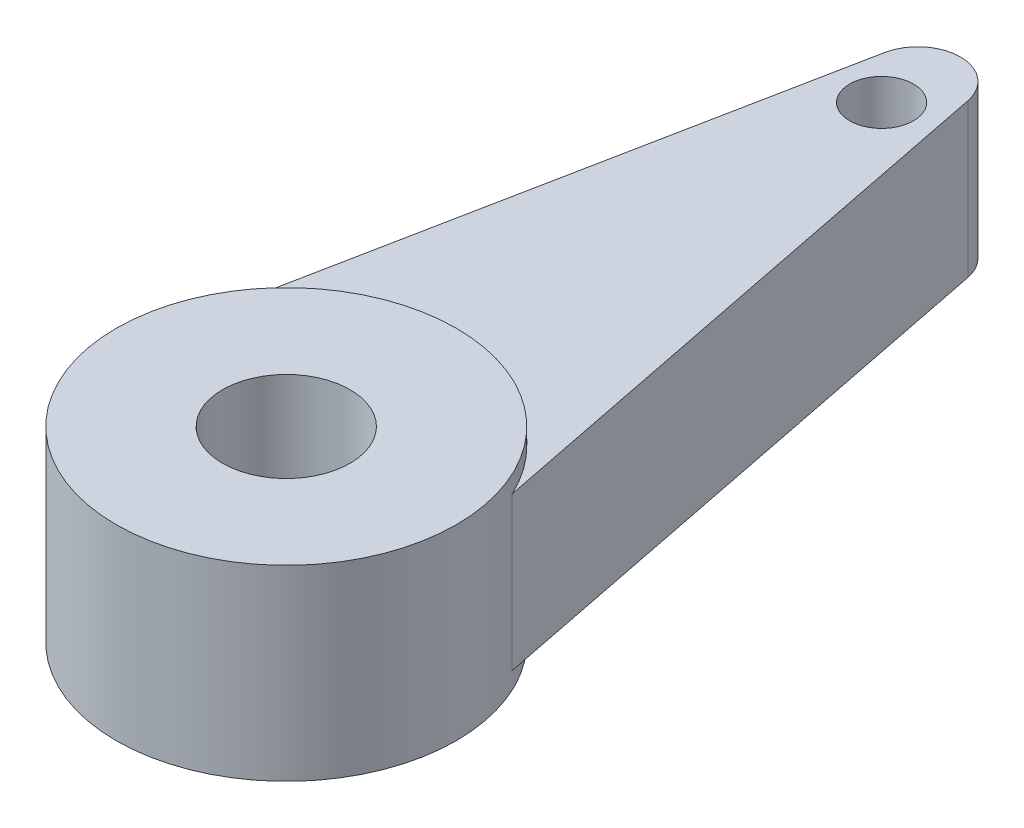
ISO-10303-21;
HEADER;
FILE_DESCRIPTION(('STEP AP214'),'2;1');
FILE_NAME('part.step','',(''),(''),'','','');
FILE_SCHEMA(('AUTOMOTIVE_DESIGN { 1 0 10303 214 1 1 1 1 }'));
ENDSEC;
DATA;
#1=APPLICATION_CONTEXT('core data for automotive mechanical design processes');
#2=APPLICATION_PROTOCOL_DEFINITION('international standard','automotive_design',2000,#1);
#3=PRODUCT_CONTEXT('',#1,'mechanical');
#4=PRODUCT('Part','Part','',(#3));
#5=PRODUCT_RELATED_PRODUCT_CATEGORY('part','',(#4));
#6=PRODUCT_DEFINITION_FORMATION('','',#4);
#7=PRODUCT_DEFINITION_CONTEXT('part definition',#1,'design');
#8=PRODUCT_DEFINITION('design','',#6,#7);
#9=PRODUCT_DEFINITION_SHAPE('','',#8);
#10=(LENGTH_UNIT() NAMED_UNIT(*) SI_UNIT(.MILLI.,.METRE.));
#11=(NAMED_UNIT(*) PLANE_ANGLE_UNIT() SI_UNIT($,.RADIAN.));
#12=(NAMED_UNIT(*) SI_UNIT($,.STERADIAN.) SOLID_ANGLE_UNIT());
#13=UNCERTAINTY_MEASURE_WITH_UNIT(LENGTH_MEASURE(1.E-05),#10,'distance_accuracy_value','');
#14=(GEOMETRIC_REPRESENTATION_CONTEXT(3) GLOBAL_UNCERTAINTY_ASSIGNED_CONTEXT((#13)) GLOBAL_UNIT_ASSIGNED_CONTEXT((#10,
#11,#12)) REPRESENTATION_CONTEXT('',''));
#15=CARTESIAN_POINT('',(0.,0.,0.));
#16=DIRECTION('',(0.,0.,1.));
#17=DIRECTION('',(1.,0.,0.));
#18=AXIS2_PLACEMENT_3D('',#15,#16,#17);
#19=CARTESIAN_POINT('',(0.,27.94,0.));
#20=DIRECTION('',(0.,-1.,0.));
#21=DIRECTION('',(0.,0.,-1.));
#22=AXIS2_PLACEMENT_3D('',#19,#20,#21);
#23=CYLINDRICAL_SURFACE('',#22,50.8);
#24=CARTESIAN_POINT('',(0.,-27.94,0.));
#25=DIRECTION('',(0.,1.,0.));
#26=DIRECTION('',(0.,0.,1.));
#27=AXIS2_PLACEMENT_3D('',#24,#25,#26);
#28=CIRCLE('',#27,50.8);
#29=CARTESIAN_POINT('',(0.,-27.94,50.8));
#30=VERTEX_POINT('',#29);
#31=EDGE_CURVE('E117',#30,#30,#28,.T.);
#32=ORIENTED_EDGE('',*,*,#31,.T.);
#33=EDGE_LOOP('',(#32));
#34=FACE_BOUND('',#33,.T.);
#35=CARTESIAN_POINT('',(0.,27.94,0.));
#36=DIRECTION('',(0.,1.,0.));
#37=DIRECTION('',(0.,0.,1.));
#38=AXIS2_PLACEMENT_3D('',#35,#36,#37);
#39=CIRCLE('',#38,50.8);
#40=CARTESIAN_POINT('',(0.,27.94,50.8));
#41=VERTEX_POINT('',#40);
#42=EDGE_CURVE('E90',#41,#41,#39,.T.);
#43=ORIENTED_EDGE('',*,*,#42,.F.);
#44=EDGE_LOOP('',(#43));
#45=FACE_BOUND('',#44,.T.);
#46=DIRECTION('',(0.,-1.,0.));
#47=VECTOR('',#46,1.);
#48=CARTESIAN_POINT('',(-46.0705210305103,22.86,-21.4043708615158));
#49=LINE('',#48,#47);
#50=CARTESIAN_POINT('',(-46.0705210305103,22.86,-21.4043708615158));
#51=VERTEX_POINT('',#50);
#52=CARTESIAN_POINT('',(-46.0705210305103,-22.86,-21.4043708615158));
#53=VERTEX_POINT('',#52);
#54=EDGE_CURVE('E87',#51,#53,#49,.T.);
#55=ORIENTED_EDGE('',*,*,#54,.T.);
#56=CARTESIAN_POINT('',(0.,-22.86,0.));
#57=DIRECTION('',(0.,1.,0.));
#58=DIRECTION('',(0.,0.,1.));
#59=AXIS2_PLACEMENT_3D('',#56,#57,#58);
#60=CIRCLE('',#59,50.8);
#61=CARTESIAN_POINT('',(46.0705210305103,-22.86,-21.4043708615158));
#62=VERTEX_POINT('',#61);
#63=EDGE_CURVE('E81',#62,#53,#60,.T.);
#64=ORIENTED_EDGE('',*,*,#63,.F.);
#65=DIRECTION('',(0.,-1.,0.));
#66=VECTOR('',#65,1.);
#67=CARTESIAN_POINT('',(46.0705210305103,22.86,-21.4043708615158));
#68=LINE('',#67,#66);
#69=CARTESIAN_POINT('',(46.0705210305103,22.86,-21.4043708615159));
#70=VERTEX_POINT('',#69);
#71=EDGE_CURVE('E84',#70,#62,#68,.T.);
#72=ORIENTED_EDGE('',*,*,#71,.F.);
#73=CARTESIAN_POINT('',(0.,22.86,0.));
#74=DIRECTION('',(0.,1.,0.));
#75=DIRECTION('',(0.,0.,1.));
#76=AXIS2_PLACEMENT_3D('',#73,#74,#75);
#77=CIRCLE('',#76,50.8);
#78=EDGE_CURVE('E89',#70,#51,#77,.T.);
#79=ORIENTED_EDGE('',*,*,#78,.T.);
#80=EDGE_LOOP('',(#55,#64,#72,#79));
#81=FACE_BOUND('',#80,.T.);
#82=ADVANCED_FACE('F39',(#34,#45,#81),#23,.T.);
#83=CARTESIAN_POINT('',(0.,27.94,0.));
#84=DIRECTION('',(0.,1.,0.));
#85=DIRECTION('',(0.,0.,1.));
#86=AXIS2_PLACEMENT_3D('',#83,#84,#85);
#87=PLANE('',#86);
#88=ORIENTED_EDGE('',*,*,#42,.T.);
#89=EDGE_LOOP('',(#88));
#90=FACE_BOUND('',#89,.T.);
#91=CARTESIAN_POINT('',(0.,27.94,0.));
#92=DIRECTION('',(0.,1.,0.));
#93=DIRECTION('',(0.,0.,1.));
#94=AXIS2_PLACEMENT_3D('',#91,#92,#93);
#95=CIRCLE('',#94,19.05);
#96=CARTESIAN_POINT('',(0.,27.94,19.05));
#97=VERTEX_POINT('',#96);
#98=EDGE_CURVE('E113',#97,#97,#95,.T.);
#99=ORIENTED_EDGE('',*,*,#98,.F.);
#100=EDGE_LOOP('',(#99));
#101=FACE_BOUND('',#100,.T.);
#102=ADVANCED_FACE('F165',(#90,#101),#87,.T.);
#103=CARTESIAN_POINT('',(0.,-27.94,0.));
#104=DIRECTION('',(0.,1.,0.));
#105=DIRECTION('',(0.,0.,1.));
#106=AXIS2_PLACEMENT_3D('',#103,#104,#105);
#107=PLANE('',#106);
#108=ORIENTED_EDGE('',*,*,#31,.F.);
#109=EDGE_LOOP('',(#108));
#110=FACE_BOUND('',#109,.T.);
#111=CARTESIAN_POINT('',(0.,-27.94,0.));
#112=DIRECTION('',(0.,1.,0.));
#113=DIRECTION('',(0.,0.,1.));
#114=AXIS2_PLACEMENT_3D('',#111,#112,#113);
#115=CIRCLE('',#114,19.05);
#116=CARTESIAN_POINT('',(0.,-27.94,19.05));
#117=VERTEX_POINT('',#116);
#118=EDGE_CURVE('E112',#117,#117,#115,.T.);
#119=ORIENTED_EDGE('',*,*,#118,.T.);
#120=EDGE_LOOP('',(#119));
#121=FACE_BOUND('',#120,.T.);
#122=ADVANCED_FACE('F160',(#110,#121),#107,.F.);
#123=CARTESIAN_POINT('',(0.,27.94,0.));
#124=DIRECTION('',(0.,-1.,0.));
#125=DIRECTION('',(0.,0.,-1.));
#126=AXIS2_PLACEMENT_3D('',#123,#124,#125);
#127=CYLINDRICAL_SURFACE('',#126,19.05);
#128=ORIENTED_EDGE('',*,*,#98,.T.);
#129=EDGE_LOOP('',(#128));
#130=FACE_BOUND('',#129,.T.);
#131=ORIENTED_EDGE('',*,*,#118,.F.);
#132=EDGE_LOOP('',(#131));
#133=FACE_BOUND('',#132,.T.);
#134=ADVANCED_FACE('F152',(#130,#133),#127,.F.);
#135=CARTESIAN_POINT('',(0.,22.86,0.));
#136=DIRECTION('',(0.,1.,0.));
#137=DIRECTION('',(0.,0.,1.));
#138=AXIS2_PLACEMENT_3D('',#135,#136,#137);
#139=PLANE('',#138);
#140=DIRECTION('',(-0.194296630022658,0.,-0.980942821759678));
#141=VECTOR('',#140,1.);
#142=CARTESIAN_POINT('',(46.0705210305103,22.86,-21.4043708615158));
#143=LINE('',#142,#141);
#144=CARTESIAN_POINT('',(12.4579738363479,22.86,-191.103592548104));
#145=VERTEX_POINT('',#144);
#146=EDGE_CURVE('E94',#70,#145,#143,.T.);
#147=ORIENTED_EDGE('',*,*,#146,.T.);
#148=CARTESIAN_POINT('',(0.,22.86,-188.636025346816));
#149=DIRECTION('',(0.,1.,0.));
#150=DIRECTION('',(0.,0.,1.));
#151=AXIS2_PLACEMENT_3D('',#148,#149,#150);
#152=CIRCLE('',#151,12.7);
#153=CARTESIAN_POINT('',(-12.4579738363479,22.86,-191.103592548104));
#154=VERTEX_POINT('',#153);
#155=EDGE_CURVE('E11',#145,#154,#152,.T.);
#156=ORIENTED_EDGE('',*,*,#155,.T.);
#157=DIRECTION('',(-0.194296630022658,0.,0.980942821759678));
#158=VECTOR('',#157,1.);
#159=CARTESIAN_POINT('',(0.,22.86,-254.));
#160=LINE('',#159,#158);
#161=EDGE_CURVE('E100',#154,#51,#160,.T.);
#162=ORIENTED_EDGE('',*,*,#161,.T.);
#163=ORIENTED_EDGE('',*,*,#78,.F.);
#164=EDGE_LOOP('',(#147,#156,#162,#163));
#165=FACE_BOUND('',#164,.T.);
#166=CARTESIAN_POINT('',(0.,22.86,-177.8));
#167=DIRECTION('',(0.,1.,0.));
#168=DIRECTION('',(0.,0.,1.));
#169=AXIS2_PLACEMENT_3D('',#166,#167,#168);
#170=CIRCLE('',#169,9.525);
#171=CARTESIAN_POINT('',(0.,22.86,-168.275));
#172=VERTEX_POINT('',#171);
#173=EDGE_CURVE('E106',#172,#172,#170,.T.);
#174=ORIENTED_EDGE('',*,*,#173,.F.);
#175=EDGE_LOOP('',(#174));
#176=FACE_BOUND('',#175,.T.);
#177=ADVANCED_FACE('F150',(#165,#176),#139,.T.);
#178=CARTESIAN_POINT('',(0.,-22.86,0.));
#179=DIRECTION('',(0.,1.,0.));
#180=DIRECTION('',(0.,0.,1.));
#181=AXIS2_PLACEMENT_3D('',#178,#179,#180);
#182=PLANE('',#181);
#183=DIRECTION('',(-0.194296630022658,0.,0.980942821759678));
#184=VECTOR('',#183,1.);
#185=CARTESIAN_POINT('',(0.,-22.86,-254.));
#186=LINE('',#185,#184);
#187=CARTESIAN_POINT('',(-12.4579738363479,-22.86,-191.103592548104));
#188=VERTEX_POINT('',#187);
#189=EDGE_CURVE('E101',#188,#53,#186,.T.);
#190=ORIENTED_EDGE('',*,*,#189,.F.);
#191=CARTESIAN_POINT('',(0.,-22.86,-188.636025346816));
#192=DIRECTION('',(0.,1.,0.));
#193=DIRECTION('',(0.,0.,1.));
#194=AXIS2_PLACEMENT_3D('',#191,#192,#193);
#195=CIRCLE('',#194,12.7);
#196=CARTESIAN_POINT('',(12.4579738363479,-22.86,-191.103592548104));
#197=VERTEX_POINT('',#196);
#198=EDGE_CURVE('E62',#188,#197,#195,.F.);
#199=ORIENTED_EDGE('',*,*,#198,.T.);
#200=DIRECTION('',(-0.194296630022658,0.,-0.980942821759678));
#201=VECTOR('',#200,1.);
#202=CARTESIAN_POINT('',(46.0705210305103,-22.86,-21.4043708615158));
#203=LINE('',#202,#201);
#204=EDGE_CURVE('E93',#62,#197,#203,.T.);
#205=ORIENTED_EDGE('',*,*,#204,.F.);
#206=ORIENTED_EDGE('',*,*,#63,.T.);
#207=EDGE_LOOP('',(#190,#199,#205,#206));
#208=FACE_BOUND('',#207,.T.);
#209=CARTESIAN_POINT('',(0.,-22.86,-177.8));
#210=DIRECTION('',(0.,1.,0.));
#211=DIRECTION('',(0.,0.,1.));
#212=AXIS2_PLACEMENT_3D('',#209,#210,#211);
#213=CIRCLE('',#212,9.525);
#214=CARTESIAN_POINT('',(0.,-22.86,-168.275));
#215=VERTEX_POINT('',#214);
#216=EDGE_CURVE('E139',#215,#215,#213,.T.);
#217=ORIENTED_EDGE('',*,*,#216,.T.);
#218=EDGE_LOOP('',(#217));
#219=FACE_BOUND('',#218,.T.);
#220=ADVANCED_FACE('F97',(#208,#219),#182,.F.);
#221=CARTESIAN_POINT('',(0.,22.86,-254.));
#222=DIRECTION('',(0.980942821759677,0.,0.194296630022658));
#223=DIRECTION('',(0.194296630022658,0.,-0.980942821759678));
#224=AXIS2_PLACEMENT_3D('',#221,#222,#223);
#225=PLANE('',#224);
#226=ORIENTED_EDGE('',*,*,#161,.F.);
#227=DIRECTION('',(0.,-1.,0.));
#228=VECTOR('',#227,1.);
#229=CARTESIAN_POINT('',(-12.4579738363479,22.86,-191.103592548104));
#230=LINE('',#229,#228);
#231=EDGE_CURVE('E129',#154,#188,#230,.T.);
#232=ORIENTED_EDGE('',*,*,#231,.T.);
#233=ORIENTED_EDGE('',*,*,#189,.T.);
#234=ORIENTED_EDGE('',*,*,#54,.F.);
#235=EDGE_LOOP('',(#226,#232,#233,#234));
#236=FACE_BOUND('',#235,.T.);
#237=ADVANCED_FACE('F158',(#236),#225,.F.);
#238=CARTESIAN_POINT('',(46.0705210305103,22.86,-21.4043708615158));
#239=DIRECTION('',(-0.980942821759677,0.,0.194296630022658));
#240=DIRECTION('',(0.194296630022658,0.,0.980942821759678));
#241=AXIS2_PLACEMENT_3D('',#238,#239,#240);
#242=PLANE('',#241);
#243=ORIENTED_EDGE('',*,*,#204,.T.);
#244=DIRECTION('',(0.,-1.,0.));
#245=VECTOR('',#244,1.);
#246=CARTESIAN_POINT('',(12.4579738363479,22.86,-191.103592548104));
#247=LINE('',#246,#245);
#248=EDGE_CURVE('E48',#197,#145,#247,.F.);
#249=ORIENTED_EDGE('',*,*,#248,.T.);
#250=ORIENTED_EDGE('',*,*,#146,.F.);
#251=ORIENTED_EDGE('',*,*,#71,.T.);
#252=EDGE_LOOP('',(#243,#249,#250,#251));
#253=FACE_BOUND('',#252,.T.);
#254=ADVANCED_FACE('F92',(#253),#242,.F.);
#255=CARTESIAN_POINT('',(0.,22.86,-177.8));
#256=DIRECTION('',(0.,-1.,0.));
#257=DIRECTION('',(0.,0.,-1.));
#258=AXIS2_PLACEMENT_3D('',#255,#256,#257);
#259=CYLINDRICAL_SURFACE('',#258,9.525);
#260=ORIENTED_EDGE('',*,*,#173,.T.);
#261=EDGE_LOOP('',(#260));
#262=FACE_BOUND('',#261,.T.);
#263=ORIENTED_EDGE('',*,*,#216,.F.);
#264=EDGE_LOOP('',(#263));
#265=FACE_BOUND('',#264,.T.);
#266=ADVANCED_FACE('F147',(#262,#265),#259,.F.);
#267=CARTESIAN_POINT('',(0.,22.86,-188.636025346816));
#268=DIRECTION('',(0.,-1.,0.));
#269=DIRECTION('',(0.,0.,-1.));
#270=AXIS2_PLACEMENT_3D('',#267,#268,#269);
#271=CYLINDRICAL_SURFACE('',#270,12.7);
#272=ORIENTED_EDGE('',*,*,#155,.F.);
#273=ORIENTED_EDGE('',*,*,#248,.F.);
#274=ORIENTED_EDGE('',*,*,#198,.F.);
#275=ORIENTED_EDGE('',*,*,#231,.F.);
#276=EDGE_LOOP('',(#272,#273,#274,#275));
#277=FACE_BOUND('',#276,.T.);
#278=ADVANCED_FACE('F41',(#277),#271,.T.);
#279=CLOSED_SHELL('',(#82,#102,#122,#134,#177,#220,#237,#254,#266,#278));
#280=MANIFOLD_SOLID_BREP('B2',#279);
#281=ADVANCED_BREP_SHAPE_REPRESENTATION('',(#18,#280),#14);
#282=SHAPE_DEFINITION_REPRESENTATION(#9,#281);
ENDSEC;
END-ISO-10303-21;
